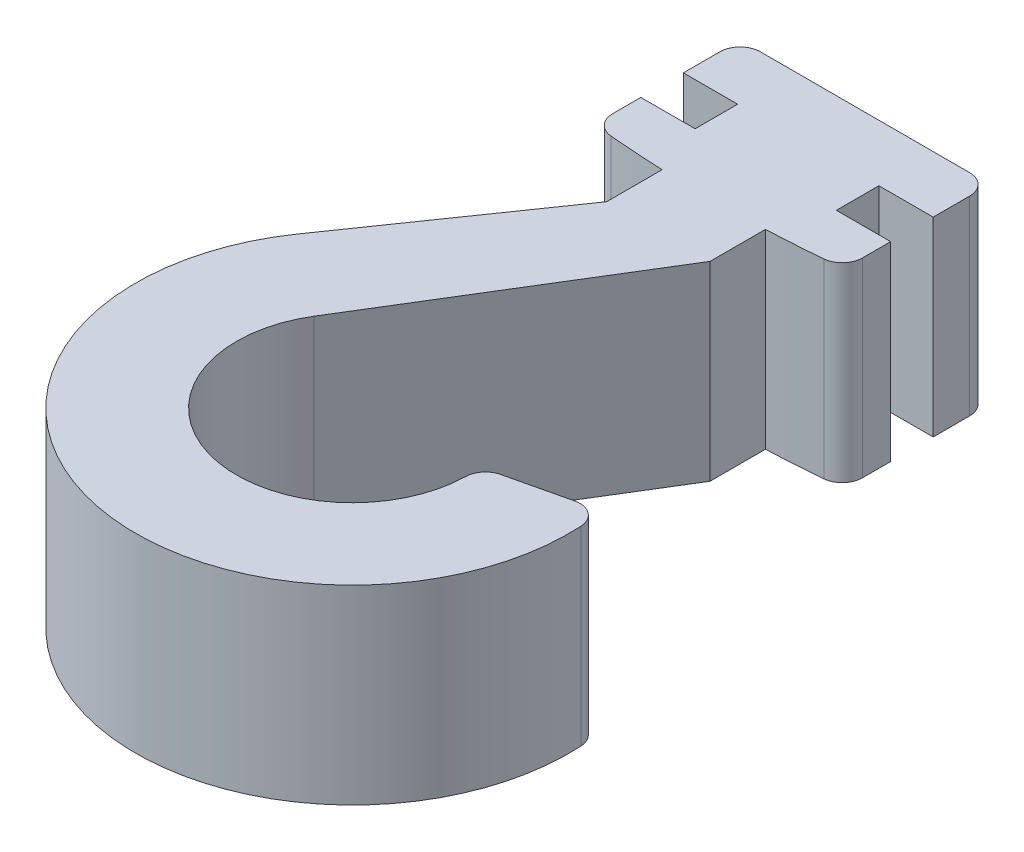
ISO-10303-21;
HEADER;
FILE_DESCRIPTION(('STEP AP214'),'2;1');
FILE_NAME('part.step','',(''),(''),'','','');
FILE_SCHEMA(('AUTOMOTIVE_DESIGN { 1 0 10303 214 1 1 1 1 }'));
ENDSEC;
DATA;
#1=APPLICATION_CONTEXT('core data for automotive mechanical design processes');
#2=APPLICATION_PROTOCOL_DEFINITION('international standard','automotive_design',2000,#1);
#3=PRODUCT_CONTEXT('',#1,'mechanical');
#4=PRODUCT('Part','Part','',(#3));
#5=PRODUCT_RELATED_PRODUCT_CATEGORY('part','',(#4));
#6=PRODUCT_DEFINITION_FORMATION('','',#4);
#7=PRODUCT_DEFINITION_CONTEXT('part definition',#1,'design');
#8=PRODUCT_DEFINITION('design','',#6,#7);
#9=PRODUCT_DEFINITION_SHAPE('','',#8);
#10=(LENGTH_UNIT() NAMED_UNIT(*) SI_UNIT(.MILLI.,.METRE.));
#11=(NAMED_UNIT(*) PLANE_ANGLE_UNIT() SI_UNIT($,.RADIAN.));
#12=(NAMED_UNIT(*) SI_UNIT($,.STERADIAN.) SOLID_ANGLE_UNIT());
#13=UNCERTAINTY_MEASURE_WITH_UNIT(LENGTH_MEASURE(1.E-05),#10,'distance_accuracy_value','');
#14=(GEOMETRIC_REPRESENTATION_CONTEXT(3) GLOBAL_UNCERTAINTY_ASSIGNED_CONTEXT((#13)) GLOBAL_UNIT_ASSIGNED_CONTEXT((#10,
#11,#12)) REPRESENTATION_CONTEXT('',''));
#15=CARTESIAN_POINT('',(0.,0.,0.));
#16=DIRECTION('',(0.,0.,1.));
#17=DIRECTION('',(1.,0.,0.));
#18=AXIS2_PLACEMENT_3D('',#15,#16,#17);
#19=CARTESIAN_POINT('',(-5.97649030851697,9.4,0.));
#20=DIRECTION('',(-1.,0.,0.));
#21=DIRECTION('',(0.,0.,1.));
#22=AXIS2_PLACEMENT_3D('',#19,#20,#21);
#23=PLANE('',#22);
#24=DIRECTION('',(0.,0.,-1.));
#25=VECTOR('',#24,1.);
#26=CARTESIAN_POINT('',(-5.97649030851697,0.,0.));
#27=LINE('',#26,#25);
#28=CARTESIAN_POINT('',(-5.97649030851697,0.,-7.22085522062209));
#29=VERTEX_POINT('',#28);
#30=CARTESIAN_POINT('',(-5.97649030851697,0.,-9.95749992862752));
#31=VERTEX_POINT('',#30);
#32=EDGE_CURVE('E234',#29,#31,#27,.T.);
#33=ORIENTED_EDGE('',*,*,#32,.T.);
#34=DIRECTION('',(0.,-1.,0.));
#35=VECTOR('',#34,1.);
#36=CARTESIAN_POINT('',(-5.97649030851697,9.4,-9.95749992862752));
#37=LINE('',#36,#35);
#38=CARTESIAN_POINT('',(-5.97649030851697,9.4,-9.95749992862752));
#39=VERTEX_POINT('',#38);
#40=EDGE_CURVE('E215',#39,#31,#37,.T.);
#41=ORIENTED_EDGE('',*,*,#40,.F.);
#42=DIRECTION('',(0.,0.,-1.));
#43=VECTOR('',#42,1.);
#44=CARTESIAN_POINT('',(-5.97649030851697,9.4,0.));
#45=LINE('',#44,#43);
#46=CARTESIAN_POINT('',(-5.97649030851697,9.4,-7.22085522062209));
#47=VERTEX_POINT('',#46);
#48=EDGE_CURVE('E221',#47,#39,#45,.T.);
#49=ORIENTED_EDGE('',*,*,#48,.F.);
#50=DIRECTION('',(0.,-1.,0.));
#51=VECTOR('',#50,1.);
#52=CARTESIAN_POINT('',(-5.97649030851697,9.4,-7.22085522062209));
#53=LINE('',#52,#51);
#54=EDGE_CURVE('E310',#47,#29,#53,.T.);
#55=ORIENTED_EDGE('',*,*,#54,.T.);
#56=EDGE_LOOP('',(#33,#41,#49,#55));
#57=FACE_BOUND('',#56,.T.);
#58=ADVANCED_FACE('F37',(#57),#23,.F.);
#59=CARTESIAN_POINT('',(-8.52649030851697,9.4,-69.903287937461));
#60=DIRECTION('',(0.,-1.,0.));
#61=DIRECTION('',(0.,0.,-1.));
#62=AXIS2_PLACEMENT_3D('',#59,#60,#61);
#63=CYLINDRICAL_SURFACE('',#62,60.);
#64=CARTESIAN_POINT('',(-8.52649030851697,0.,-69.903287937461));
#65=DIRECTION('',(0.,1.,0.));
#66=DIRECTION('',(0.,0.,1.));
#67=AXIS2_PLACEMENT_3D('',#64,#65,#66);
#68=CIRCLE('',#67,60.);
#69=CARTESIAN_POINT('',(-3.27394793563561,0.,-10.1336401334034));
#70=VERTEX_POINT('',#69);
#71=EDGE_CURVE('E403',#31,#70,#68,.T.);
#72=ORIENTED_EDGE('',*,*,#71,.T.);
#73=DIRECTION('',(0.,-1.,0.));
#74=VECTOR('',#73,1.);
#75=CARTESIAN_POINT('',(-3.27394793563561,9.4,-10.1336401334034));
#76=LINE('',#75,#74);
#77=CARTESIAN_POINT('',(-3.27394793563561,9.4,-10.1336401334034));
#78=VERTEX_POINT('',#77);
#79=EDGE_CURVE('E218',#70,#78,#76,.F.);
#80=ORIENTED_EDGE('',*,*,#79,.T.);
#81=CARTESIAN_POINT('',(-8.52649030851697,9.4,-69.903287937461));
#82=DIRECTION('',(0.,1.,0.));
#83=DIRECTION('',(0.,0.,1.));
#84=AXIS2_PLACEMENT_3D('',#81,#82,#83);
#85=CIRCLE('',#84,60.);
#86=EDGE_CURVE('E210',#39,#78,#85,.T.);
#87=ORIENTED_EDGE('',*,*,#86,.F.);
#88=ORIENTED_EDGE('',*,*,#40,.T.);
#89=EDGE_LOOP('',(#72,#80,#87,#88));
#90=FACE_BOUND('',#89,.T.);
#91=ADVANCED_FACE('F213',(#90),#63,.T.);
#92=CARTESIAN_POINT('',(-2.36149030851696,9.4,0.));
#93=DIRECTION('',(-1.,0.,0.));
#94=DIRECTION('',(0.,0.,1.));
#95=AXIS2_PLACEMENT_3D('',#92,#93,#94);
#96=PLANE('',#95);
#97=DIRECTION('',(0.,0.,-1.));
#98=VECTOR('',#97,1.);
#99=CARTESIAN_POINT('',(-2.36149030851696,9.4,0.));
#100=LINE('',#99,#98);
#101=CARTESIAN_POINT('',(-2.36149030851697,9.4,-11.1298009301377));
#102=VERTEX_POINT('',#101);
#103=CARTESIAN_POINT('',(-2.36149030851697,9.4,-12.5208552206221));
#104=VERTEX_POINT('',#103);
#105=EDGE_CURVE('E220',#102,#104,#100,.T.);
#106=ORIENTED_EDGE('',*,*,#105,.F.);
#107=DIRECTION('',(0.,-1.,0.));
#108=VECTOR('',#107,1.);
#109=CARTESIAN_POINT('',(-2.36149030851697,9.4,-11.1298009301377));
#110=LINE('',#109,#108);
#111=CARTESIAN_POINT('',(-2.36149030851697,0.,-11.1298009301377));
#112=VERTEX_POINT('',#111);
#113=EDGE_CURVE('E235',#102,#112,#110,.T.);
#114=ORIENTED_EDGE('',*,*,#113,.T.);
#115=DIRECTION('',(0.,0.,-1.));
#116=VECTOR('',#115,1.);
#117=CARTESIAN_POINT('',(-2.36149030851696,0.,0.));
#118=LINE('',#117,#116);
#119=CARTESIAN_POINT('',(-2.36149030851697,0.,-12.5208552206221));
#120=VERTEX_POINT('',#119);
#121=EDGE_CURVE('E359',#112,#120,#118,.T.);
#122=ORIENTED_EDGE('',*,*,#121,.T.);
#123=DIRECTION('',(0.,-1.,0.));
#124=VECTOR('',#123,1.);
#125=CARTESIAN_POINT('',(-2.36149030851697,9.4,-12.5208552206221));
#126=LINE('',#125,#124);
#127=EDGE_CURVE('E236',#104,#120,#126,.T.);
#128=ORIENTED_EDGE('',*,*,#127,.F.);
#129=EDGE_LOOP('',(#106,#114,#122,#128));
#130=FACE_BOUND('',#129,.T.);
#131=ADVANCED_FACE('F440',(#130),#96,.F.);
#132=CARTESIAN_POINT('',(0.,9.4,-12.5208552206221));
#133=DIRECTION('',(0.,0.,1.));
#134=DIRECTION('',(1.,0.,0.));
#135=AXIS2_PLACEMENT_3D('',#132,#133,#134);
#136=PLANE('',#135);
#137=DIRECTION('',(-1.,0.,0.));
#138=VECTOR('',#137,1.);
#139=CARTESIAN_POINT('',(0.,0.,-12.5208552206221));
#140=LINE('',#139,#138);
#141=CARTESIAN_POINT('',(-5.04149030851697,0.,-12.5208552206221));
#142=VERTEX_POINT('',#141);
#143=EDGE_CURVE('E353',#120,#142,#140,.T.);
#144=ORIENTED_EDGE('',*,*,#143,.T.);
#145=DIRECTION('',(0.,-1.,0.));
#146=VECTOR('',#145,1.);
#147=CARTESIAN_POINT('',(-5.04149030851697,9.4,-12.5208552206221));
#148=LINE('',#147,#146);
#149=CARTESIAN_POINT('',(-5.04149030851697,9.4,-12.5208552206221));
#150=VERTEX_POINT('',#149);
#151=EDGE_CURVE('E242',#150,#142,#148,.T.);
#152=ORIENTED_EDGE('',*,*,#151,.F.);
#153=DIRECTION('',(-1.,0.,0.));
#154=VECTOR('',#153,1.);
#155=CARTESIAN_POINT('',(0.,9.4,-12.5208552206221));
#156=LINE('',#155,#154);
#157=EDGE_CURVE('E434',#104,#150,#156,.T.);
#158=ORIENTED_EDGE('',*,*,#157,.F.);
#159=ORIENTED_EDGE('',*,*,#127,.T.);
#160=EDGE_LOOP('',(#144,#152,#158,#159));
#161=FACE_BOUND('',#160,.T.);
#162=ADVANCED_FACE('F441',(#161),#136,.F.);
#163=CARTESIAN_POINT('',(-5.04149030851699,9.4,0.));
#164=DIRECTION('',(-1.,0.,0.));
#165=DIRECTION('',(0.,0.,1.));
#166=AXIS2_PLACEMENT_3D('',#163,#164,#165);
#167=PLANE('',#166);
#168=DIRECTION('',(0.,0.,-1.));
#169=VECTOR('',#168,1.);
#170=CARTESIAN_POINT('',(-5.04149030851699,0.,0.));
#171=LINE('',#170,#169);
#172=CARTESIAN_POINT('',(-5.04149030851697,0.,-14.6208552206221));
#173=VERTEX_POINT('',#172);
#174=EDGE_CURVE('E347',#142,#173,#171,.T.);
#175=ORIENTED_EDGE('',*,*,#174,.T.);
#176=DIRECTION('',(0.,-1.,0.));
#177=VECTOR('',#176,1.);
#178=CARTESIAN_POINT('',(-5.04149030851697,9.4,-14.6208552206221));
#179=LINE('',#178,#177);
#180=CARTESIAN_POINT('',(-5.04149030851697,9.4,-14.6208552206221));
#181=VERTEX_POINT('',#180);
#182=EDGE_CURVE('E338',#181,#173,#179,.T.);
#183=ORIENTED_EDGE('',*,*,#182,.F.);
#184=DIRECTION('',(0.,0.,-1.));
#185=VECTOR('',#184,1.);
#186=CARTESIAN_POINT('',(-5.04149030851699,9.4,0.));
#187=LINE('',#186,#185);
#188=EDGE_CURVE('E348',#150,#181,#187,.T.);
#189=ORIENTED_EDGE('',*,*,#188,.F.);
#190=ORIENTED_EDGE('',*,*,#151,.T.);
#191=EDGE_LOOP('',(#175,#183,#189,#190));
#192=FACE_BOUND('',#191,.T.);
#193=ADVANCED_FACE('F345',(#192),#167,.F.);
#194=CARTESIAN_POINT('',(0.,9.4,-14.6208552206221));
#195=DIRECTION('',(0.,0.,-1.));
#196=DIRECTION('',(-1.,0.,0.));
#197=AXIS2_PLACEMENT_3D('',#194,#195,#196);
#198=PLANE('',#197);
#199=DIRECTION('',(1.,0.,0.));
#200=VECTOR('',#199,1.);
#201=CARTESIAN_POINT('',(0.,0.,-14.6208552206221));
#202=LINE('',#201,#200);
#203=CARTESIAN_POINT('',(-2.36149030851697,0.,-14.6208552206221));
#204=VERTEX_POINT('',#203);
#205=EDGE_CURVE('E355',#173,#204,#202,.T.);
#206=ORIENTED_EDGE('',*,*,#205,.T.);
#207=DIRECTION('',(0.,-1.,0.));
#208=VECTOR('',#207,1.);
#209=CARTESIAN_POINT('',(-2.36149030851697,9.4,-14.6208552206221));
#210=LINE('',#209,#208);
#211=CARTESIAN_POINT('',(-2.36149030851697,9.4,-14.6208552206221));
#212=VERTEX_POINT('',#211);
#213=EDGE_CURVE('E335',#212,#204,#210,.T.);
#214=ORIENTED_EDGE('',*,*,#213,.F.);
#215=DIRECTION('',(1.,0.,0.));
#216=VECTOR('',#215,1.);
#217=CARTESIAN_POINT('',(0.,9.4,-14.6208552206221));
#218=LINE('',#217,#216);
#219=EDGE_CURVE('E431',#181,#212,#218,.T.);
#220=ORIENTED_EDGE('',*,*,#219,.F.);
#221=ORIENTED_EDGE('',*,*,#182,.T.);
#222=EDGE_LOOP('',(#206,#214,#220,#221));
#223=FACE_BOUND('',#222,.T.);
#224=ADVANCED_FACE('F448',(#223),#198,.F.);
#225=CARTESIAN_POINT('',(-2.36149030851696,9.4,0.));
#226=DIRECTION('',(-1.,0.,0.));
#227=DIRECTION('',(0.,0.,1.));
#228=AXIS2_PLACEMENT_3D('',#225,#226,#227);
#229=PLANE('',#228);
#230=DIRECTION('',(0.,0.,-1.));
#231=VECTOR('',#230,1.);
#232=CARTESIAN_POINT('',(-2.36149030851696,0.,0.));
#233=LINE('',#232,#231);
#234=CARTESIAN_POINT('',(-2.36149030851697,0.,-16.4208552206221));
#235=VERTEX_POINT('',#234);
#236=EDGE_CURVE('E357',#204,#235,#233,.T.);
#237=ORIENTED_EDGE('',*,*,#236,.T.);
#238=DIRECTION('',(0.,-1.,0.));
#239=VECTOR('',#238,1.);
#240=CARTESIAN_POINT('',(-2.36149030851697,9.4,-16.4208552206221));
#241=LINE('',#240,#239);
#242=CARTESIAN_POINT('',(-2.36149030851697,9.4,-16.4208552206221));
#243=VERTEX_POINT('',#242);
#244=EDGE_CURVE('E279',#235,#243,#241,.F.);
#245=ORIENTED_EDGE('',*,*,#244,.T.);
#246=DIRECTION('',(0.,0.,-1.));
#247=VECTOR('',#246,1.);
#248=CARTESIAN_POINT('',(-2.36149030851696,9.4,0.));
#249=LINE('',#248,#247);
#250=EDGE_CURVE('E428',#212,#243,#249,.T.);
#251=ORIENTED_EDGE('',*,*,#250,.F.);
#252=ORIENTED_EDGE('',*,*,#213,.T.);
#253=EDGE_LOOP('',(#237,#245,#251,#252));
#254=FACE_BOUND('',#253,.T.);
#255=ADVANCED_FACE('F530',(#254),#229,.F.);
#256=CARTESIAN_POINT('',(0.,9.4,-17.4208552206221));
#257=DIRECTION('',(0.,0.,-1.));
#258=DIRECTION('',(-1.,0.,0.));
#259=AXIS2_PLACEMENT_3D('',#256,#257,#258);
#260=PLANE('',#259);
#261=DIRECTION('',(1.,0.,0.));
#262=VECTOR('',#261,1.);
#263=CARTESIAN_POINT('',(0.,9.4,-17.4208552206221));
#264=LINE('',#263,#262);
#265=CARTESIAN_POINT('',(-13.691490308517,9.4,-17.4208552206221));
#266=VERTEX_POINT('',#265);
#267=CARTESIAN_POINT('',(-3.36149030851697,9.4,-17.4208552206221));
#268=VERTEX_POINT('',#267);
#269=EDGE_CURVE('E425',#266,#268,#264,.T.);
#270=ORIENTED_EDGE('',*,*,#269,.T.);
#271=DIRECTION('',(0.,-1.,0.));
#272=VECTOR('',#271,1.);
#273=CARTESIAN_POINT('',(-3.36149030851697,0.,-17.4208552206221));
#274=LINE('',#273,#272);
#275=CARTESIAN_POINT('',(-3.36149030851697,0.,-17.4208552206221));
#276=VERTEX_POINT('',#275);
#277=EDGE_CURVE('E276',#268,#276,#274,.T.);
#278=ORIENTED_EDGE('',*,*,#277,.T.);
#279=DIRECTION('',(1.,0.,0.));
#280=VECTOR('',#279,1.);
#281=CARTESIAN_POINT('',(0.,0.,-17.4208552206221));
#282=LINE('',#281,#280);
#283=CARTESIAN_POINT('',(-13.691490308517,0.,-17.4208552206221));
#284=VERTEX_POINT('',#283);
#285=EDGE_CURVE('E365',#284,#276,#282,.T.);
#286=ORIENTED_EDGE('',*,*,#285,.F.);
#287=DIRECTION('',(0.,-1.,0.));
#288=VECTOR('',#287,1.);
#289=CARTESIAN_POINT('',(-13.691490308517,9.4,-17.4208552206221));
#290=LINE('',#289,#288);
#291=EDGE_CURVE('E274',#284,#266,#290,.F.);
#292=ORIENTED_EDGE('',*,*,#291,.T.);
#293=EDGE_LOOP('',(#270,#278,#286,#292));
#294=FACE_BOUND('',#293,.T.);
#295=ADVANCED_FACE('F526',(#294),#260,.T.);
#296=CARTESIAN_POINT('',(-14.691490308517,9.4,0.));
#297=DIRECTION('',(1.,0.,0.));
#298=DIRECTION('',(0.,0.,-1.));
#299=AXIS2_PLACEMENT_3D('',#296,#297,#298);
#300=PLANE('',#299);
#301=DIRECTION('',(0.,0.,1.));
#302=VECTOR('',#301,1.);
#303=CARTESIAN_POINT('',(-14.691490308517,9.4,0.));
#304=LINE('',#303,#302);
#305=CARTESIAN_POINT('',(-14.691490308517,9.4,-16.4208552206221));
#306=VERTEX_POINT('',#305);
#307=CARTESIAN_POINT('',(-14.691490308517,9.4,-14.6208552206221));
#308=VERTEX_POINT('',#307);
#309=EDGE_CURVE('E423',#306,#308,#304,.T.);
#310=ORIENTED_EDGE('',*,*,#309,.F.);
#311=DIRECTION('',(0.,-1.,0.));
#312=VECTOR('',#311,1.);
#313=CARTESIAN_POINT('',(-14.691490308517,0.,-16.4208552206221));
#314=LINE('',#313,#312);
#315=CARTESIAN_POINT('',(-14.691490308517,0.,-16.4208552206221));
#316=VERTEX_POINT('',#315);
#317=EDGE_CURVE('E281',#306,#316,#314,.T.);
#318=ORIENTED_EDGE('',*,*,#317,.T.);
#319=DIRECTION('',(0.,0.,1.));
#320=VECTOR('',#319,1.);
#321=CARTESIAN_POINT('',(-14.691490308517,0.,0.));
#322=LINE('',#321,#320);
#323=CARTESIAN_POINT('',(-14.691490308517,0.,-14.6208552206221));
#324=VERTEX_POINT('',#323);
#325=EDGE_CURVE('E368',#316,#324,#322,.T.);
#326=ORIENTED_EDGE('',*,*,#325,.T.);
#327=DIRECTION('',(0.,-1.,0.));
#328=VECTOR('',#327,1.);
#329=CARTESIAN_POINT('',(-14.691490308517,9.4,-14.6208552206221));
#330=LINE('',#329,#328);
#331=EDGE_CURVE('E332',#308,#324,#330,.T.);
#332=ORIENTED_EDGE('',*,*,#331,.F.);
#333=EDGE_LOOP('',(#310,#318,#326,#332));
#334=FACE_BOUND('',#333,.T.);
#335=ADVANCED_FACE('F522',(#334),#300,.F.);
#336=CARTESIAN_POINT('',(0.,9.4,-14.6208552206221));
#337=DIRECTION('',(0.,0.,-1.));
#338=DIRECTION('',(-1.,0.,0.));
#339=AXIS2_PLACEMENT_3D('',#336,#337,#338);
#340=PLANE('',#339);
#341=DIRECTION('',(1.,0.,0.));
#342=VECTOR('',#341,1.);
#343=CARTESIAN_POINT('',(0.,0.,-14.6208552206221));
#344=LINE('',#343,#342);
#345=CARTESIAN_POINT('',(-12.011490308517,0.,-14.6208552206221));
#346=VERTEX_POINT('',#345);
#347=EDGE_CURVE('E370',#324,#346,#344,.T.);
#348=ORIENTED_EDGE('',*,*,#347,.T.);
#349=DIRECTION('',(0.,-1.,0.));
#350=VECTOR('',#349,1.);
#351=CARTESIAN_POINT('',(-12.011490308517,9.4,-14.6208552206221));
#352=LINE('',#351,#350);
#353=CARTESIAN_POINT('',(-12.011490308517,9.4,-14.6208552206221));
#354=VERTEX_POINT('',#353);
#355=EDGE_CURVE('E329',#354,#346,#352,.T.);
#356=ORIENTED_EDGE('',*,*,#355,.F.);
#357=DIRECTION('',(1.,0.,0.));
#358=VECTOR('',#357,1.);
#359=CARTESIAN_POINT('',(0.,9.4,-14.6208552206221));
#360=LINE('',#359,#358);
#361=EDGE_CURVE('E421',#308,#354,#360,.T.);
#362=ORIENTED_EDGE('',*,*,#361,.F.);
#363=ORIENTED_EDGE('',*,*,#331,.T.);
#364=EDGE_LOOP('',(#348,#356,#362,#363));
#365=FACE_BOUND('',#364,.T.);
#366=ADVANCED_FACE('F518',(#365),#340,.F.);
#367=CARTESIAN_POINT('',(-12.0114903085169,9.4,0.));
#368=DIRECTION('',(1.,0.,0.));
#369=DIRECTION('',(0.,0.,-1.));
#370=AXIS2_PLACEMENT_3D('',#367,#368,#369);
#371=PLANE('',#370);
#372=DIRECTION('',(0.,0.,1.));
#373=VECTOR('',#372,1.);
#374=CARTESIAN_POINT('',(-12.0114903085169,0.,0.));
#375=LINE('',#374,#373);
#376=CARTESIAN_POINT('',(-12.011490308517,0.,-12.5208552206221));
#377=VERTEX_POINT('',#376);
#378=EDGE_CURVE('E372',#346,#377,#375,.T.);
#379=ORIENTED_EDGE('',*,*,#378,.T.);
#380=DIRECTION('',(0.,-1.,0.));
#381=VECTOR('',#380,1.);
#382=CARTESIAN_POINT('',(-12.011490308517,9.4,-12.5208552206221));
#383=LINE('',#382,#381);
#384=CARTESIAN_POINT('',(-12.011490308517,9.4,-12.5208552206221));
#385=VERTEX_POINT('',#384);
#386=EDGE_CURVE('E326',#385,#377,#383,.T.);
#387=ORIENTED_EDGE('',*,*,#386,.F.);
#388=DIRECTION('',(0.,0.,1.));
#389=VECTOR('',#388,1.);
#390=CARTESIAN_POINT('',(-12.0114903085169,9.4,0.));
#391=LINE('',#390,#389);
#392=EDGE_CURVE('E419',#354,#385,#391,.T.);
#393=ORIENTED_EDGE('',*,*,#392,.F.);
#394=ORIENTED_EDGE('',*,*,#355,.T.);
#395=EDGE_LOOP('',(#379,#387,#393,#394));
#396=FACE_BOUND('',#395,.T.);
#397=ADVANCED_FACE('F514',(#396),#371,.F.);
#398=CARTESIAN_POINT('',(0.,9.4,-12.5208552206221));
#399=DIRECTION('',(0.,0.,1.));
#400=DIRECTION('',(1.,0.,0.));
#401=AXIS2_PLACEMENT_3D('',#398,#399,#400);
#402=PLANE('',#401);
#403=DIRECTION('',(-1.,0.,0.));
#404=VECTOR('',#403,1.);
#405=CARTESIAN_POINT('',(0.,0.,-12.5208552206221));
#406=LINE('',#405,#404);
#407=CARTESIAN_POINT('',(-14.691490308517,0.,-12.5208552206221));
#408=VERTEX_POINT('',#407);
#409=EDGE_CURVE('E374',#377,#408,#406,.T.);
#410=ORIENTED_EDGE('',*,*,#409,.T.);
#411=DIRECTION('',(0.,-1.,0.));
#412=VECTOR('',#411,1.);
#413=CARTESIAN_POINT('',(-14.691490308517,9.4,-12.5208552206221));
#414=LINE('',#413,#412);
#415=CARTESIAN_POINT('',(-14.691490308517,9.4,-12.5208552206221));
#416=VERTEX_POINT('',#415);
#417=EDGE_CURVE('E323',#416,#408,#414,.T.);
#418=ORIENTED_EDGE('',*,*,#417,.F.);
#419=DIRECTION('',(-1.,0.,0.));
#420=VECTOR('',#419,1.);
#421=CARTESIAN_POINT('',(0.,9.4,-12.5208552206221));
#422=LINE('',#421,#420);
#423=EDGE_CURVE('E417',#385,#416,#422,.T.);
#424=ORIENTED_EDGE('',*,*,#423,.F.);
#425=ORIENTED_EDGE('',*,*,#386,.T.);
#426=EDGE_LOOP('',(#410,#418,#424,#425));
#427=FACE_BOUND('',#426,.T.);
#428=ADVANCED_FACE('F510',(#427),#402,.F.);
#429=CARTESIAN_POINT('',(-14.691490308517,9.4,0.));
#430=DIRECTION('',(1.,0.,0.));
#431=DIRECTION('',(0.,0.,-1.));
#432=AXIS2_PLACEMENT_3D('',#429,#430,#431);
#433=PLANE('',#432);
#434=DIRECTION('',(0.,0.,1.));
#435=VECTOR('',#434,1.);
#436=CARTESIAN_POINT('',(-14.691490308517,0.,0.));
#437=LINE('',#436,#435);
#438=CARTESIAN_POINT('',(-14.691490308517,0.,-11.1298009301377));
#439=VERTEX_POINT('',#438);
#440=EDGE_CURVE('E376',#408,#439,#437,.T.);
#441=ORIENTED_EDGE('',*,*,#440,.T.);
#442=DIRECTION('',(0.,-1.,0.));
#443=VECTOR('',#442,1.);
#444=CARTESIAN_POINT('',(-14.691490308517,9.4,-11.1298009301377));
#445=LINE('',#444,#443);
#446=CARTESIAN_POINT('',(-14.691490308517,9.4,-11.1298009301377));
#447=VERTEX_POINT('',#446);
#448=EDGE_CURVE('E272',#439,#447,#445,.F.);
#449=ORIENTED_EDGE('',*,*,#448,.T.);
#450=DIRECTION('',(0.,0.,1.));
#451=VECTOR('',#450,1.);
#452=CARTESIAN_POINT('',(-14.691490308517,9.4,0.));
#453=LINE('',#452,#451);
#454=EDGE_CURVE('E414',#416,#447,#453,.T.);
#455=ORIENTED_EDGE('',*,*,#454,.F.);
#456=ORIENTED_EDGE('',*,*,#417,.T.);
#457=EDGE_LOOP('',(#441,#449,#455,#456));
#458=FACE_BOUND('',#457,.T.);
#459=ADVANCED_FACE('F507',(#458),#433,.F.);
#460=CARTESIAN_POINT('',(-13.7790326813983,9.4,-10.1336401334034));
#461=VERTEX_POINT('',#460);
#462=CARTESIAN_POINT('',(-11.076490308517,9.4,-9.95749992862752));
#463=VERTEX_POINT('',#462);
#464=EDGE_CURVE('E223',#461,#463,#85,.T.);
#465=ORIENTED_EDGE('',*,*,#464,.F.);
#466=DIRECTION('',(0.,-1.,0.));
#467=VECTOR('',#466,1.);
#468=CARTESIAN_POINT('',(-13.7790326813983,9.4,-10.1336401334034));
#469=LINE('',#468,#467);
#470=CARTESIAN_POINT('',(-13.7790326813983,0.,-10.1336401334034));
#471=VERTEX_POINT('',#470);
#472=EDGE_CURVE('E269',#461,#471,#469,.T.);
#473=ORIENTED_EDGE('',*,*,#472,.T.);
#474=CARTESIAN_POINT('',(-11.076490308517,0.,-9.95749992862752));
#475=VERTEX_POINT('',#474);
#476=EDGE_CURVE('E379',#471,#475,#68,.T.);
#477=ORIENTED_EDGE('',*,*,#476,.T.);
#478=DIRECTION('',(0.,-1.,0.));
#479=VECTOR('',#478,1.);
#480=CARTESIAN_POINT('',(-11.076490308517,9.4,-9.95749992862752));
#481=LINE('',#480,#479);
#482=EDGE_CURVE('E320',#463,#475,#481,.T.);
#483=ORIENTED_EDGE('',*,*,#482,.F.);
#484=EDGE_LOOP('',(#465,#473,#477,#483));
#485=FACE_BOUND('',#484,.T.);
#486=ADVANCED_FACE('F400',(#485),#63,.T.);
#487=CARTESIAN_POINT('',(-11.076490308517,9.4,0.));
#488=DIRECTION('',(1.,0.,0.));
#489=DIRECTION('',(0.,0.,-1.));
#490=AXIS2_PLACEMENT_3D('',#487,#488,#489);
#491=PLANE('',#490);
#492=DIRECTION('',(0.,0.,1.));
#493=VECTOR('',#492,1.);
#494=CARTESIAN_POINT('',(-11.076490308517,0.,0.));
#495=LINE('',#494,#493);
#496=CARTESIAN_POINT('',(-11.076490308517,0.,-7.22085522062209));
#497=VERTEX_POINT('',#496);
#498=EDGE_CURVE('E380',#475,#497,#495,.T.);
#499=ORIENTED_EDGE('',*,*,#498,.T.);
#500=DIRECTION('',(0.,-1.,0.));
#501=VECTOR('',#500,1.);
#502=CARTESIAN_POINT('',(-11.076490308517,9.4,-7.22085522062209));
#503=LINE('',#502,#501);
#504=CARTESIAN_POINT('',(-11.076490308517,9.4,-7.22085522062209));
#505=VERTEX_POINT('',#504);
#506=EDGE_CURVE('E318',#505,#497,#503,.T.);
#507=ORIENTED_EDGE('',*,*,#506,.F.);
#508=DIRECTION('',(0.,0.,1.));
#509=VECTOR('',#508,1.);
#510=CARTESIAN_POINT('',(-11.076490308517,9.4,0.));
#511=LINE('',#510,#509);
#512=EDGE_CURVE('E397',#463,#505,#511,.T.);
#513=ORIENTED_EDGE('',*,*,#512,.F.);
#514=ORIENTED_EDGE('',*,*,#482,.T.);
#515=EDGE_LOOP('',(#499,#507,#513,#514));
#516=FACE_BOUND('',#515,.T.);
#517=ADVANCED_FACE('F395',(#516),#491,.F.);
#518=CARTESIAN_POINT('',(-10.8611067520281,9.4,-7.53145953175129));
#519=DIRECTION('',(-0.82175883603061,0.,-0.569835428352447));
#520=DIRECTION('',(-0.569835428352447,0.,0.82175883603061));
#521=AXIS2_PLACEMENT_3D('',#518,#519,#520);
#522=PLANE('',#521);
#523=DIRECTION('',(0.569835428352447,0.,-0.821758836030611));
#524=VECTOR('',#523,1.);
#525=CARTESIAN_POINT('',(-10.8611067520281,0.,-7.53145953175129));
#526=LINE('',#525,#524);
#527=CARTESIAN_POINT('',(-17.3193098540445,0.,1.78190569600673));
#528=VERTEX_POINT('',#527);
#529=EDGE_CURVE('E305',#528,#497,#526,.T.);
#530=ORIENTED_EDGE('',*,*,#529,.F.);
#531=DIRECTION('',(0.,-1.,0.));
#532=VECTOR('',#531,1.);
#533=CARTESIAN_POINT('',(-17.3193098540445,9.4,1.78190569600673));
#534=LINE('',#533,#532);
#535=CARTESIAN_POINT('',(-17.3193098540445,9.4,1.78190569600673));
#536=VERTEX_POINT('',#535);
#537=EDGE_CURVE('E315',#536,#528,#534,.T.);
#538=ORIENTED_EDGE('',*,*,#537,.F.);
#539=DIRECTION('',(0.569835428352447,0.,-0.821758836030611));
#540=VECTOR('',#539,1.);
#541=CARTESIAN_POINT('',(-10.8611067520281,9.4,-7.53145953175129));
#542=LINE('',#541,#540);
#543=EDGE_CURVE('E392',#536,#505,#542,.T.);
#544=ORIENTED_EDGE('',*,*,#543,.T.);
#545=ORIENTED_EDGE('',*,*,#506,.T.);
#546=EDGE_LOOP('',(#530,#538,#544,#545));
#547=FACE_BOUND('',#546,.T.);
#548=ADVANCED_FACE('F388',(#547),#522,.T.);
#549=CARTESIAN_POINT('',(-8.52649030851697,9.4,7.87914477937791));
#550=DIRECTION('',(0.,-1.,0.));
#551=DIRECTION('',(0.,0.,-1.));
#552=AXIS2_PLACEMENT_3D('',#549,#550,#551);
#553=CYLINDRICAL_SURFACE('',#552,10.7);
#554=CARTESIAN_POINT('',(-8.52649030851697,0.,7.87914477937791));
#555=DIRECTION('',(0.,1.,0.));
#556=DIRECTION('',(0.,0.,1.));
#557=AXIS2_PLACEMENT_3D('',#554,#555,#556);
#558=CIRCLE('',#557,10.7);
#559=CARTESIAN_POINT('',(2.15645041161035,0.,7.27517659292643));
#560=VERTEX_POINT('',#559);
#561=EDGE_CURVE('E302',#560,#528,#558,.F.);
#562=ORIENTED_EDGE('',*,*,#561,.F.);
#563=DIRECTION('',(0.,-1.,0.));
#564=VECTOR('',#563,1.);
#565=CARTESIAN_POINT('',(2.15645041161035,9.4,7.27517659292643));
#566=LINE('',#565,#564);
#567=CARTESIAN_POINT('',(2.15645041161035,9.4,7.27517659292643));
#568=VERTEX_POINT('',#567);
#569=EDGE_CURVE('E11',#560,#568,#566,.F.);
#570=ORIENTED_EDGE('',*,*,#569,.T.);
#571=CARTESIAN_POINT('',(-8.52649030851697,9.4,7.87914477937791));
#572=DIRECTION('',(0.,1.,0.));
#573=DIRECTION('',(0.,0.,1.));
#574=AXIS2_PLACEMENT_3D('',#571,#572,#573);
#575=CIRCLE('',#574,10.7);
#576=EDGE_CURVE('E410',#568,#536,#575,.F.);
#577=ORIENTED_EDGE('',*,*,#576,.T.);
#578=ORIENTED_EDGE('',*,*,#537,.T.);
#579=EDGE_LOOP('',(#562,#570,#577,#578));
#580=FACE_BOUND('',#579,.T.);
#581=ADVANCED_FACE('F498',(#580),#553,.T.);
#582=CARTESIAN_POINT('',(1.46819673653769,9.4,6.23115979785183));
#583=DIRECTION('',(0.229341487321173,0.,0.973346023875021));
#584=DIRECTION('',(0.973346023875021,0.,-0.229341487321173));
#585=AXIS2_PLACEMENT_3D('',#582,#583,#584);
#586=PLANE('',#585);
#587=DIRECTION('',(-0.973346023875021,0.,0.229341487321173));
#588=VECTOR('',#587,1.);
#589=CARTESIAN_POINT('',(1.46819673653769,0.,6.23115979785183));
#590=LINE('',#589,#588);
#591=CARTESIAN_POINT('',(0.928703249510924,0.,6.35827619395342));
#592=VERTEX_POINT('',#591);
#593=CARTESIAN_POINT('',(-2.03814327533914,0.,7.05732974528342));
#594=VERTEX_POINT('',#593);
#595=EDGE_CURVE('E292',#592,#594,#590,.T.);
#596=ORIENTED_EDGE('',*,*,#595,.T.);
#597=DIRECTION('',(0.,-1.,0.));
#598=VECTOR('',#597,1.);
#599=CARTESIAN_POINT('',(-2.03814327533914,9.4,7.05732974528342));
#600=LINE('',#599,#598);
#601=CARTESIAN_POINT('',(-2.03814327533914,9.4,7.05732974528342));
#602=VERTEX_POINT('',#601);
#603=EDGE_CURVE('E45',#594,#602,#600,.F.);
#604=ORIENTED_EDGE('',*,*,#603,.T.);
#605=DIRECTION('',(-0.973346023875021,0.,0.229341487321173));
#606=VECTOR('',#605,1.);
#607=CARTESIAN_POINT('',(1.46819673653769,9.4,6.23115979785183));
#608=LINE('',#607,#606);
#609=CARTESIAN_POINT('',(0.928703249510924,9.4,6.35827619395342));
#610=VERTEX_POINT('',#609);
#611=EDGE_CURVE('E293',#610,#602,#608,.T.);
#612=ORIENTED_EDGE('',*,*,#611,.F.);
#613=DIRECTION('',(0.,1.,0.));
#614=VECTOR('',#613,1.);
#615=CARTESIAN_POINT('',(0.928703249510924,0.,6.35827619395342));
#616=LINE('',#615,#614);
#617=EDGE_CURVE('E287',#610,#592,#616,.F.);
#618=ORIENTED_EDGE('',*,*,#617,.T.);
#619=EDGE_LOOP('',(#596,#604,#612,#618));
#620=FACE_BOUND('',#619,.T.);
#621=ADVANCED_FACE('F291',(#620),#586,.F.);
#622=CARTESIAN_POINT('',(-8.52649030851697,9.4,7.87914477937791));
#623=DIRECTION('',(0.,-1.,0.));
#624=DIRECTION('',(0.,0.,-1.));
#625=AXIS2_PLACEMENT_3D('',#622,#623,#624);
#626=CYLINDRICAL_SURFACE('',#625,5.71939734643725);
#627=CARTESIAN_POINT('',(-8.52649030851697,9.4,7.87914477937791));
#628=DIRECTION('',(0.,1.,0.));
#629=DIRECTION('',(0.,0.,1.));
#630=AXIS2_PLACEMENT_3D('',#627,#628,#629);
#631=CIRCLE('',#630,5.71939734643725);
#632=CARTESIAN_POINT('',(-2.80854747563694,9.4,8.00812449231501));
#633=VERTEX_POINT('',#632);
#634=CARTESIAN_POINT('',(-13.4022573369469,9.4,4.88942875759447));
#635=VERTEX_POINT('',#634);
#636=EDGE_CURVE('E407',#633,#635,#631,.F.);
#637=ORIENTED_EDGE('',*,*,#636,.F.);
#638=DIRECTION('',(0.,-1.,0.));
#639=VECTOR('',#638,1.);
#640=CARTESIAN_POINT('',(-2.80854747563694,9.4,8.00812449231501));
#641=LINE('',#640,#639);
#642=CARTESIAN_POINT('',(-2.80854747563694,0.,8.00812449231501));
#643=VERTEX_POINT('',#642);
#644=EDGE_CURVE('E284',#633,#643,#641,.T.);
#645=ORIENTED_EDGE('',*,*,#644,.T.);
#646=CARTESIAN_POINT('',(-8.52649030851697,0.,7.87914477937791));
#647=DIRECTION('',(0.,1.,0.));
#648=DIRECTION('',(0.,0.,1.));
#649=AXIS2_PLACEMENT_3D('',#646,#647,#648);
#650=CIRCLE('',#649,5.71939734643725);
#651=CARTESIAN_POINT('',(-13.4022573369469,0.,4.88942875759447));
#652=VERTEX_POINT('',#651);
#653=EDGE_CURVE('E301',#643,#652,#650,.F.);
#654=ORIENTED_EDGE('',*,*,#653,.T.);
#655=DIRECTION('',(0.,-1.,0.));
#656=VECTOR('',#655,1.);
#657=CARTESIAN_POINT('',(-13.4022573369469,9.4,4.88942875759447));
#658=LINE('',#657,#656);
#659=EDGE_CURVE('E312',#635,#652,#658,.T.);
#660=ORIENTED_EDGE('',*,*,#659,.F.);
#661=EDGE_LOOP('',(#637,#645,#654,#660));
#662=FACE_BOUND('',#661,.T.);
#663=ADVANCED_FACE('F481',(#662),#626,.F.);
#664=CARTESIAN_POINT('',(-7.56123180474729,9.4,-4.63638556544214));
#665=DIRECTION('',(-0.852496641358063,0.,-0.5227327007881));
#666=DIRECTION('',(-0.5227327007881,0.,0.852496641358064));
#667=AXIS2_PLACEMENT_3D('',#664,#665,#666);
#668=PLANE('',#667);
#669=DIRECTION('',(0.5227327007881,0.,-0.852496641358063));
#670=VECTOR('',#669,1.);
#671=CARTESIAN_POINT('',(-7.56123180474729,0.,-4.63638556544214));
#672=LINE('',#671,#670);
#673=EDGE_CURVE('E231',#652,#29,#672,.T.);
#674=ORIENTED_EDGE('',*,*,#673,.T.);
#675=ORIENTED_EDGE('',*,*,#54,.F.);
#676=DIRECTION('',(0.5227327007881,0.,-0.852496641358063));
#677=VECTOR('',#676,1.);
#678=CARTESIAN_POINT('',(-7.56123180474729,9.4,-4.63638556544214));
#679=LINE('',#678,#677);
#680=EDGE_CURVE('E227',#635,#47,#679,.T.);
#681=ORIENTED_EDGE('',*,*,#680,.F.);
#682=ORIENTED_EDGE('',*,*,#659,.T.);
#683=EDGE_LOOP('',(#674,#675,#681,#682));
#684=FACE_BOUND('',#683,.T.);
#685=ADVANCED_FACE('F485',(#684),#668,.F.);
#686=CARTESIAN_POINT('',(0.,9.4,0.));
#687=DIRECTION('',(0.,1.,0.));
#688=DIRECTION('',(0.,0.,1.));
#689=AXIS2_PLACEMENT_3D('',#686,#687,#688);
#690=PLANE('',#689);
#691=ORIENTED_EDGE('',*,*,#86,.T.);
#692=CARTESIAN_POINT('',(-3.36149030851697,9.4,-11.1298009301377));
#693=DIRECTION('',(0.,1.,0.));
#694=DIRECTION('',(0.,0.,1.));
#695=AXIS2_PLACEMENT_3D('',#692,#693,#694);
#696=CIRCLE('',#695,1.);
#697=EDGE_CURVE('E267',#78,#102,#696,.T.);
#698=ORIENTED_EDGE('',*,*,#697,.T.);
#699=ORIENTED_EDGE('',*,*,#105,.T.);
#700=ORIENTED_EDGE('',*,*,#157,.T.);
#701=ORIENTED_EDGE('',*,*,#188,.T.);
#702=ORIENTED_EDGE('',*,*,#219,.T.);
#703=ORIENTED_EDGE('',*,*,#250,.T.);
#704=CARTESIAN_POINT('',(-3.36149030851697,9.4,-16.4208552206221));
#705=DIRECTION('',(0.,1.,0.));
#706=DIRECTION('',(0.,0.,1.));
#707=AXIS2_PLACEMENT_3D('',#704,#705,#706);
#708=CIRCLE('',#707,1.);
#709=EDGE_CURVE('E263',#243,#268,#708,.T.);
#710=ORIENTED_EDGE('',*,*,#709,.T.);
#711=ORIENTED_EDGE('',*,*,#269,.F.);
#712=CARTESIAN_POINT('',(-13.691490308517,9.4,-16.4208552206221));
#713=DIRECTION('',(0.,1.,0.));
#714=DIRECTION('',(0.,0.,1.));
#715=AXIS2_PLACEMENT_3D('',#712,#713,#714);
#716=CIRCLE('',#715,1.);
#717=EDGE_CURVE('E261',#266,#306,#716,.T.);
#718=ORIENTED_EDGE('',*,*,#717,.T.);
#719=ORIENTED_EDGE('',*,*,#309,.T.);
#720=ORIENTED_EDGE('',*,*,#361,.T.);
#721=ORIENTED_EDGE('',*,*,#392,.T.);
#722=ORIENTED_EDGE('',*,*,#423,.T.);
#723=ORIENTED_EDGE('',*,*,#454,.T.);
#724=CARTESIAN_POINT('',(-13.691490308517,9.4,-11.1298009301377));
#725=DIRECTION('',(0.,1.,0.));
#726=DIRECTION('',(0.,0.,1.));
#727=AXIS2_PLACEMENT_3D('',#724,#725,#726);
#728=CIRCLE('',#727,1.);
#729=EDGE_CURVE('E265',#447,#461,#728,.T.);
#730=ORIENTED_EDGE('',*,*,#729,.T.);
#731=ORIENTED_EDGE('',*,*,#464,.T.);
#732=ORIENTED_EDGE('',*,*,#512,.T.);
#733=ORIENTED_EDGE('',*,*,#543,.F.);
#734=ORIENTED_EDGE('',*,*,#576,.F.);
#735=CARTESIAN_POINT('',(1.1580447368321,9.4,7.33162221782844));
#736=DIRECTION('',(0.,1.,0.));
#737=DIRECTION('',(0.,0.,1.));
#738=AXIS2_PLACEMENT_3D('',#735,#736,#737);
#739=CIRCLE('',#738,1.);
#740=EDGE_CURVE('E258',#568,#610,#739,.T.);
#741=ORIENTED_EDGE('',*,*,#740,.T.);
#742=ORIENTED_EDGE('',*,*,#611,.T.);
#743=CARTESIAN_POINT('',(-1.80880178801797,9.4,8.03067576915844));
#744=DIRECTION('',(0.,1.,0.));
#745=DIRECTION('',(0.,0.,1.));
#746=AXIS2_PLACEMENT_3D('',#743,#744,#745);
#747=CIRCLE('',#746,1.);
#748=EDGE_CURVE('E52',#602,#633,#747,.T.);
#749=ORIENTED_EDGE('',*,*,#748,.T.);
#750=ORIENTED_EDGE('',*,*,#636,.T.);
#751=ORIENTED_EDGE('',*,*,#680,.T.);
#752=ORIENTED_EDGE('',*,*,#48,.T.);
#753=EDGE_LOOP('',(#691,#698,#699,#700,#701,#702,#703,#710,#711,#718,#719,#720,#721,#722,#723,
#730,#731,#732,#733,#734,#741,#742,#749,#750,#751,#752));
#754=FACE_BOUND('',#753,.T.);
#755=ADVANCED_FACE('F225',(#754),#690,.T.);
#756=CARTESIAN_POINT('',(0.,0.,0.));
#757=DIRECTION('',(0.,1.,0.));
#758=DIRECTION('',(0.,0.,1.));
#759=AXIS2_PLACEMENT_3D('',#756,#757,#758);
#760=PLANE('',#759);
#761=ORIENTED_EDGE('',*,*,#121,.F.);
#762=CARTESIAN_POINT('',(-3.36149030851697,0.,-11.1298009301377));
#763=DIRECTION('',(0.,1.,0.));
#764=DIRECTION('',(0.,0.,1.));
#765=AXIS2_PLACEMENT_3D('',#762,#763,#764);
#766=CIRCLE('',#765,1.);
#767=EDGE_CURVE('E255',#112,#70,#766,.F.);
#768=ORIENTED_EDGE('',*,*,#767,.T.);
#769=ORIENTED_EDGE('',*,*,#71,.F.);
#770=ORIENTED_EDGE('',*,*,#32,.F.);
#771=ORIENTED_EDGE('',*,*,#673,.F.);
#772=ORIENTED_EDGE('',*,*,#653,.F.);
#773=CARTESIAN_POINT('',(-1.80880178801797,0.,8.03067576915844));
#774=DIRECTION('',(0.,1.,0.));
#775=DIRECTION('',(0.,0.,1.));
#776=AXIS2_PLACEMENT_3D('',#773,#774,#775);
#777=CIRCLE('',#776,1.);
#778=EDGE_CURVE('E247',#643,#594,#777,.F.);
#779=ORIENTED_EDGE('',*,*,#778,.T.);
#780=ORIENTED_EDGE('',*,*,#595,.F.);
#781=CARTESIAN_POINT('',(1.1580447368321,0.,7.33162221782844));
#782=DIRECTION('',(0.,1.,0.));
#783=DIRECTION('',(0.,0.,1.));
#784=AXIS2_PLACEMENT_3D('',#781,#782,#783);
#785=CIRCLE('',#784,1.);
#786=EDGE_CURVE('E239',#592,#560,#785,.F.);
#787=ORIENTED_EDGE('',*,*,#786,.T.);
#788=ORIENTED_EDGE('',*,*,#561,.T.);
#789=ORIENTED_EDGE('',*,*,#529,.T.);
#790=ORIENTED_EDGE('',*,*,#498,.F.);
#791=ORIENTED_EDGE('',*,*,#476,.F.);
#792=CARTESIAN_POINT('',(-13.691490308517,0.,-11.1298009301377));
#793=DIRECTION('',(0.,1.,0.));
#794=DIRECTION('',(0.,0.,1.));
#795=AXIS2_PLACEMENT_3D('',#792,#793,#794);
#796=CIRCLE('',#795,1.);
#797=EDGE_CURVE('E253',#471,#439,#796,.F.);
#798=ORIENTED_EDGE('',*,*,#797,.T.);
#799=ORIENTED_EDGE('',*,*,#440,.F.);
#800=ORIENTED_EDGE('',*,*,#409,.F.);
#801=ORIENTED_EDGE('',*,*,#378,.F.);
#802=ORIENTED_EDGE('',*,*,#347,.F.);
#803=ORIENTED_EDGE('',*,*,#325,.F.);
#804=CARTESIAN_POINT('',(-13.691490308517,0.,-16.4208552206221));
#805=DIRECTION('',(0.,1.,0.));
#806=DIRECTION('',(0.,0.,1.));
#807=AXIS2_PLACEMENT_3D('',#804,#805,#806);
#808=CIRCLE('',#807,1.);
#809=EDGE_CURVE('E249',#316,#284,#808,.F.);
#810=ORIENTED_EDGE('',*,*,#809,.T.);
#811=ORIENTED_EDGE('',*,*,#285,.T.);
#812=CARTESIAN_POINT('',(-3.36149030851697,0.,-16.4208552206221));
#813=DIRECTION('',(0.,1.,0.));
#814=DIRECTION('',(0.,0.,1.));
#815=AXIS2_PLACEMENT_3D('',#812,#813,#814);
#816=CIRCLE('',#815,1.);
#817=EDGE_CURVE('E251',#276,#235,#816,.F.);
#818=ORIENTED_EDGE('',*,*,#817,.T.);
#819=ORIENTED_EDGE('',*,*,#236,.F.);
#820=ORIENTED_EDGE('',*,*,#205,.F.);
#821=ORIENTED_EDGE('',*,*,#174,.F.);
#822=ORIENTED_EDGE('',*,*,#143,.F.);
#823=EDGE_LOOP('',(#761,#768,#769,#770,#771,#772,#779,#780,#787,#788,#789,#790,#791,#798,#799,
#800,#801,#802,#803,#810,#811,#818,#819,#820,#821,#822));
#824=FACE_BOUND('',#823,.T.);
#825=ADVANCED_FACE('F298',(#824),#760,.F.);
#826=CARTESIAN_POINT('',(-3.36149030851697,9.4,-11.1298009301377));
#827=DIRECTION('',(0.,-1.,0.));
#828=DIRECTION('',(0.,0.,-1.));
#829=AXIS2_PLACEMENT_3D('',#826,#827,#828);
#830=CYLINDRICAL_SURFACE('',#829,1.);
#831=ORIENTED_EDGE('',*,*,#697,.F.);
#832=ORIENTED_EDGE('',*,*,#79,.F.);
#833=ORIENTED_EDGE('',*,*,#767,.F.);
#834=ORIENTED_EDGE('',*,*,#113,.F.);
#835=EDGE_LOOP('',(#831,#832,#833,#834));
#836=FACE_BOUND('',#835,.T.);
#837=ADVANCED_FACE('F458',(#836),#830,.T.);
#838=CARTESIAN_POINT('',(-13.691490308517,9.4,-11.1298009301377));
#839=DIRECTION('',(0.,-1.,0.));
#840=DIRECTION('',(0.,0.,-1.));
#841=AXIS2_PLACEMENT_3D('',#838,#839,#840);
#842=CYLINDRICAL_SURFACE('',#841,1.);
#843=ORIENTED_EDGE('',*,*,#729,.F.);
#844=ORIENTED_EDGE('',*,*,#448,.F.);
#845=ORIENTED_EDGE('',*,*,#797,.F.);
#846=ORIENTED_EDGE('',*,*,#472,.F.);
#847=EDGE_LOOP('',(#843,#844,#845,#846));
#848=FACE_BOUND('',#847,.T.);
#849=ADVANCED_FACE('F461',(#848),#842,.T.);
#850=CARTESIAN_POINT('',(-3.36149030851697,9.4,-16.4208552206221));
#851=DIRECTION('',(0.,1.,0.));
#852=DIRECTION('',(0.,0.,1.));
#853=AXIS2_PLACEMENT_3D('',#850,#851,#852);
#854=CYLINDRICAL_SURFACE('',#853,1.);
#855=ORIENTED_EDGE('',*,*,#709,.F.);
#856=ORIENTED_EDGE('',*,*,#244,.F.);
#857=ORIENTED_EDGE('',*,*,#817,.F.);
#858=ORIENTED_EDGE('',*,*,#277,.F.);
#859=EDGE_LOOP('',(#855,#856,#857,#858));
#860=FACE_BOUND('',#859,.T.);
#861=ADVANCED_FACE('F465',(#860),#854,.T.);
#862=CARTESIAN_POINT('',(-13.691490308517,9.4,-16.4208552206221));
#863=DIRECTION('',(0.,1.,0.));
#864=DIRECTION('',(0.,0.,1.));
#865=AXIS2_PLACEMENT_3D('',#862,#863,#864);
#866=CYLINDRICAL_SURFACE('',#865,1.);
#867=ORIENTED_EDGE('',*,*,#717,.F.);
#868=ORIENTED_EDGE('',*,*,#291,.F.);
#869=ORIENTED_EDGE('',*,*,#809,.F.);
#870=ORIENTED_EDGE('',*,*,#317,.F.);
#871=EDGE_LOOP('',(#867,#868,#869,#870));
#872=FACE_BOUND('',#871,.T.);
#873=ADVANCED_FACE('F469',(#872),#866,.T.);
#874=CARTESIAN_POINT('',(-1.80880178801797,9.4,8.03067576915844));
#875=DIRECTION('',(0.,-1.,0.));
#876=DIRECTION('',(0.,0.,-1.));
#877=AXIS2_PLACEMENT_3D('',#874,#875,#876);
#878=CYLINDRICAL_SURFACE('',#877,1.);
#879=ORIENTED_EDGE('',*,*,#748,.F.);
#880=ORIENTED_EDGE('',*,*,#603,.F.);
#881=ORIENTED_EDGE('',*,*,#778,.F.);
#882=ORIENTED_EDGE('',*,*,#644,.F.);
#883=EDGE_LOOP('',(#879,#880,#881,#882));
#884=FACE_BOUND('',#883,.T.);
#885=ADVANCED_FACE('F472',(#884),#878,.T.);
#886=CARTESIAN_POINT('',(1.1580447368321,9.4,7.33162221782844));
#887=DIRECTION('',(0.,-1.,0.));
#888=DIRECTION('',(0.,0.,-1.));
#889=AXIS2_PLACEMENT_3D('',#886,#887,#888);
#890=CYLINDRICAL_SURFACE('',#889,1.);
#891=ORIENTED_EDGE('',*,*,#740,.F.);
#892=ORIENTED_EDGE('',*,*,#569,.F.);
#893=ORIENTED_EDGE('',*,*,#786,.F.);
#894=ORIENTED_EDGE('',*,*,#617,.F.);
#895=EDGE_LOOP('',(#891,#892,#893,#894));
#896=FACE_BOUND('',#895,.T.);
#897=ADVANCED_FACE('F39',(#896),#890,.T.);
#898=CLOSED_SHELL('',(#58,#91,#131,#162,#193,#224,#255,#295,#335,#366,#397,#428,#459,#486,#517,
#548,#581,#621,#663,#685,#755,#825,#837,#849,#861,#873,#885,#897));
#899=MANIFOLD_SOLID_BREP('B2',#898);
#900=ADVANCED_BREP_SHAPE_REPRESENTATION('',(#18,#899),#14);
#901=SHAPE_DEFINITION_REPRESENTATION(#9,#900);
ENDSEC;
END-ISO-10303-21;
